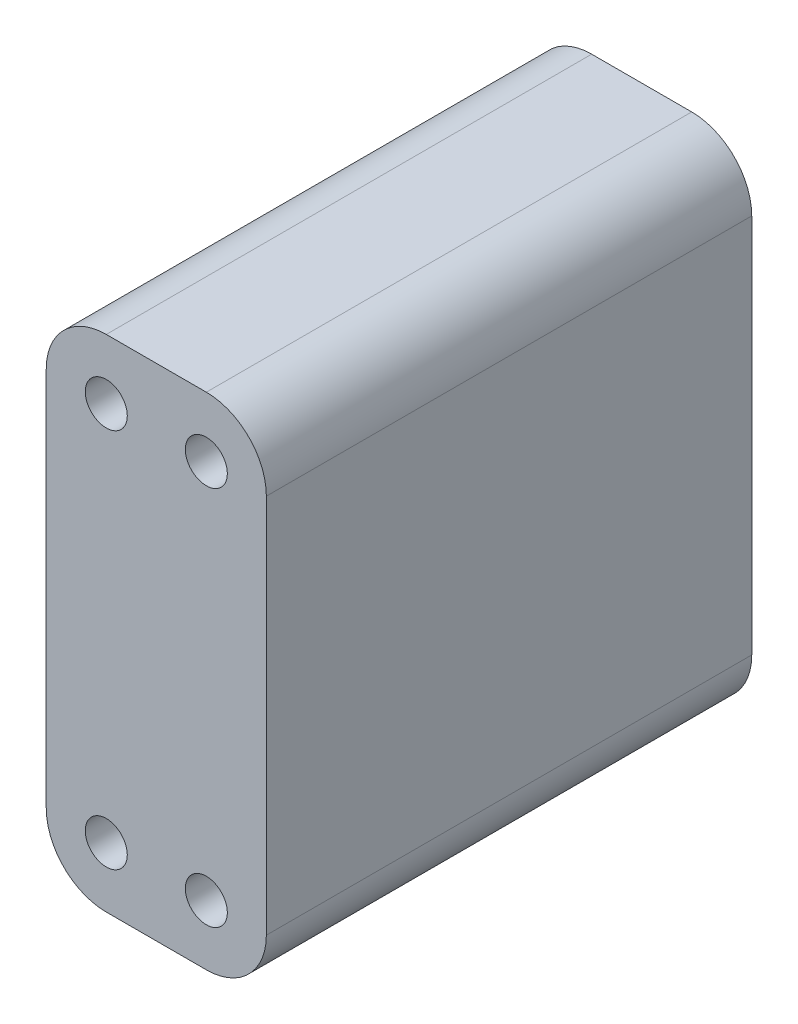
ISO-10303-21;
HEADER;
FILE_DESCRIPTION(('STEP AP214'),'2;1');
FILE_NAME('part.step','',(''),(''),'','','');
FILE_SCHEMA(('AUTOMOTIVE_DESIGN { 1 0 10303 214 1 1 1 1 }'));
ENDSEC;
DATA;
#1=APPLICATION_CONTEXT('core data for automotive mechanical design processes');
#2=APPLICATION_PROTOCOL_DEFINITION('international standard','automotive_design',2000,#1);
#3=PRODUCT_CONTEXT('',#1,'mechanical');
#4=PRODUCT('Part','Part','',(#3));
#5=PRODUCT_RELATED_PRODUCT_CATEGORY('part','',(#4));
#6=PRODUCT_DEFINITION_FORMATION('','',#4);
#7=PRODUCT_DEFINITION_CONTEXT('part definition',#1,'design');
#8=PRODUCT_DEFINITION('design','',#6,#7);
#9=PRODUCT_DEFINITION_SHAPE('','',#8);
#10=(LENGTH_UNIT() NAMED_UNIT(*) SI_UNIT(.MILLI.,.METRE.));
#11=(NAMED_UNIT(*) PLANE_ANGLE_UNIT() SI_UNIT($,.RADIAN.));
#12=(NAMED_UNIT(*) SI_UNIT($,.STERADIAN.) SOLID_ANGLE_UNIT());
#13=UNCERTAINTY_MEASURE_WITH_UNIT(LENGTH_MEASURE(1.E-05),#10,'distance_accuracy_value','');
#14=(GEOMETRIC_REPRESENTATION_CONTEXT(3) GLOBAL_UNCERTAINTY_ASSIGNED_CONTEXT((#13)) GLOBAL_UNIT_ASSIGNED_CONTEXT((#10,
#11,#12)) REPRESENTATION_CONTEXT('',''));
#15=CARTESIAN_POINT('',(0.,0.,0.));
#16=DIRECTION('',(0.,0.,1.));
#17=DIRECTION('',(1.,0.,0.));
#18=AXIS2_PLACEMENT_3D('',#15,#16,#17);
#19=CARTESIAN_POINT('',(-11.,25.,48.514));
#20=DIRECTION('',(1.,0.,0.));
#21=DIRECTION('',(0.,0.,-1.));
#22=AXIS2_PLACEMENT_3D('',#19,#20,#21);
#23=PLANE('',#22);
#24=DIRECTION('',(0.,-1.,0.));
#25=VECTOR('',#24,1.);
#26=CARTESIAN_POINT('',(-11.,25.,48.514));
#27=LINE('',#26,#25);
#28=CARTESIAN_POINT('',(-11.,19.,48.514));
#29=VERTEX_POINT('',#28);
#30=CARTESIAN_POINT('',(-11.,-19.,48.514));
#31=VERTEX_POINT('',#30);
#32=EDGE_CURVE('E135',#29,#31,#27,.T.);
#33=ORIENTED_EDGE('',*,*,#32,.F.);
#34=DIRECTION('',(0.,0.,-1.));
#35=VECTOR('',#34,1.);
#36=CARTESIAN_POINT('',(-11.,19.,48.514));
#37=LINE('',#36,#35);
#38=CARTESIAN_POINT('',(-11.,19.,0.));
#39=VERTEX_POINT('',#38);
#40=EDGE_CURVE('E174',#29,#39,#37,.T.);
#41=ORIENTED_EDGE('',*,*,#40,.T.);
#42=DIRECTION('',(0.,-1.,0.));
#43=VECTOR('',#42,1.);
#44=CARTESIAN_POINT('',(-11.,25.,0.));
#45=LINE('',#44,#43);
#46=CARTESIAN_POINT('',(-11.,-19.,0.));
#47=VERTEX_POINT('',#46);
#48=EDGE_CURVE('E189',#39,#47,#45,.T.);
#49=ORIENTED_EDGE('',*,*,#48,.T.);
#50=DIRECTION('',(0.,0.,-1.));
#51=VECTOR('',#50,1.);
#52=CARTESIAN_POINT('',(-11.,-19.,48.514));
#53=LINE('',#52,#51);
#54=EDGE_CURVE('E171',#47,#31,#53,.F.);
#55=ORIENTED_EDGE('',*,*,#54,.T.);
#56=EDGE_LOOP('',(#33,#41,#49,#55));
#57=FACE_BOUND('',#56,.T.);
#58=ADVANCED_FACE('F39',(#57),#23,.F.);
#59=CARTESIAN_POINT('',(-11.,-25.,48.514));
#60=DIRECTION('',(0.,1.,0.));
#61=DIRECTION('',(-1.,0.,0.));
#62=AXIS2_PLACEMENT_3D('',#59,#60,#61);
#63=PLANE('',#62);
#64=DIRECTION('',(1.,0.,0.));
#65=VECTOR('',#64,1.);
#66=CARTESIAN_POINT('',(-11.,-25.,48.514));
#67=LINE('',#66,#65);
#68=CARTESIAN_POINT('',(-5.00000000000001,-25.,48.514));
#69=VERTEX_POINT('',#68);
#70=CARTESIAN_POINT('',(4.99999999999999,-25.,48.514));
#71=VERTEX_POINT('',#70);
#72=EDGE_CURVE('E140',#69,#71,#67,.T.);
#73=ORIENTED_EDGE('',*,*,#72,.F.);
#74=DIRECTION('',(0.,0.,-1.));
#75=VECTOR('',#74,1.);
#76=CARTESIAN_POINT('',(-5.00000000000001,-25.,48.514));
#77=LINE('',#76,#75);
#78=CARTESIAN_POINT('',(-5.00000000000001,-25.,0.));
#79=VERTEX_POINT('',#78);
#80=EDGE_CURVE('E11',#69,#79,#77,.T.);
#81=ORIENTED_EDGE('',*,*,#80,.T.);
#82=DIRECTION('',(1.,0.,0.));
#83=VECTOR('',#82,1.);
#84=CARTESIAN_POINT('',(-11.,-25.,0.));
#85=LINE('',#84,#83);
#86=CARTESIAN_POINT('',(4.99999999999999,-25.,0.));
#87=VERTEX_POINT('',#86);
#88=EDGE_CURVE('E142',#79,#87,#85,.T.);
#89=ORIENTED_EDGE('',*,*,#88,.T.);
#90=DIRECTION('',(0.,0.,-1.));
#91=VECTOR('',#90,1.);
#92=CARTESIAN_POINT('',(4.99999999999999,-25.,48.514));
#93=LINE('',#92,#91);
#94=EDGE_CURVE('E48',#87,#71,#93,.F.);
#95=ORIENTED_EDGE('',*,*,#94,.T.);
#96=EDGE_LOOP('',(#73,#81,#89,#95));
#97=FACE_BOUND('',#96,.T.);
#98=ADVANCED_FACE('F195',(#97),#63,.F.);
#99=CARTESIAN_POINT('',(11.,25.,48.514));
#100=DIRECTION('',(-1.,0.,0.));
#101=DIRECTION('',(0.,-1.,0.));
#102=AXIS2_PLACEMENT_3D('',#99,#100,#101);
#103=PLANE('',#102);
#104=DIRECTION('',(0.,1.,0.));
#105=VECTOR('',#104,1.);
#106=CARTESIAN_POINT('',(11.,25.,0.));
#107=LINE('',#106,#105);
#108=CARTESIAN_POINT('',(11.,-19.,0.));
#109=VERTEX_POINT('',#108);
#110=CARTESIAN_POINT('',(11.,19.,0.));
#111=VERTEX_POINT('',#110);
#112=EDGE_CURVE('E136',#109,#111,#107,.T.);
#113=ORIENTED_EDGE('',*,*,#112,.T.);
#114=DIRECTION('',(0.,0.,-1.));
#115=VECTOR('',#114,1.);
#116=CARTESIAN_POINT('',(11.,19.,48.514));
#117=LINE('',#116,#115);
#118=CARTESIAN_POINT('',(11.,19.,48.514));
#119=VERTEX_POINT('',#118);
#120=EDGE_CURVE('E111',#111,#119,#117,.F.);
#121=ORIENTED_EDGE('',*,*,#120,.T.);
#122=DIRECTION('',(0.,1.,0.));
#123=VECTOR('',#122,1.);
#124=CARTESIAN_POINT('',(11.,25.,48.514));
#125=LINE('',#124,#123);
#126=CARTESIAN_POINT('',(11.,-19.,48.514));
#127=VERTEX_POINT('',#126);
#128=EDGE_CURVE('E180',#127,#119,#125,.T.);
#129=ORIENTED_EDGE('',*,*,#128,.F.);
#130=DIRECTION('',(0.,0.,-1.));
#131=VECTOR('',#130,1.);
#132=CARTESIAN_POINT('',(11.,-19.,48.514));
#133=LINE('',#132,#131);
#134=EDGE_CURVE('E117',#127,#109,#133,.T.);
#135=ORIENTED_EDGE('',*,*,#134,.T.);
#136=EDGE_LOOP('',(#113,#121,#129,#135));
#137=FACE_BOUND('',#136,.T.);
#138=ADVANCED_FACE('F202',(#137),#103,.F.);
#139=CARTESIAN_POINT('',(-11.,25.,48.514));
#140=DIRECTION('',(0.,-1.,0.));
#141=DIRECTION('',(1.,0.,0.));
#142=AXIS2_PLACEMENT_3D('',#139,#140,#141);
#143=PLANE('',#142);
#144=DIRECTION('',(-1.,0.,0.));
#145=VECTOR('',#144,1.);
#146=CARTESIAN_POINT('',(-11.,25.,48.514));
#147=LINE('',#146,#145);
#148=CARTESIAN_POINT('',(4.99999999999999,25.,48.514));
#149=VERTEX_POINT('',#148);
#150=CARTESIAN_POINT('',(-5.00000000000001,25.,48.514));
#151=VERTEX_POINT('',#150);
#152=EDGE_CURVE('E127',#149,#151,#147,.T.);
#153=ORIENTED_EDGE('',*,*,#152,.F.);
#154=DIRECTION('',(0.,0.,-1.));
#155=VECTOR('',#154,1.);
#156=CARTESIAN_POINT('',(4.99999999999999,25.,48.514));
#157=LINE('',#156,#155);
#158=CARTESIAN_POINT('',(4.99999999999999,25.,0.));
#159=VERTEX_POINT('',#158);
#160=EDGE_CURVE('E110',#149,#159,#157,.T.);
#161=ORIENTED_EDGE('',*,*,#160,.T.);
#162=DIRECTION('',(-1.,0.,0.));
#163=VECTOR('',#162,1.);
#164=CARTESIAN_POINT('',(-11.,25.,0.));
#165=LINE('',#164,#163);
#166=CARTESIAN_POINT('',(-5.00000000000001,25.,0.));
#167=VERTEX_POINT('',#166);
#168=EDGE_CURVE('E124',#159,#167,#165,.T.);
#169=ORIENTED_EDGE('',*,*,#168,.T.);
#170=DIRECTION('',(0.,0.,-1.));
#171=VECTOR('',#170,1.);
#172=CARTESIAN_POINT('',(-5.00000000000001,25.,48.514));
#173=LINE('',#172,#171);
#174=EDGE_CURVE('E130',#167,#151,#173,.F.);
#175=ORIENTED_EDGE('',*,*,#174,.T.);
#176=EDGE_LOOP('',(#153,#161,#169,#175));
#177=FACE_BOUND('',#176,.T.);
#178=ADVANCED_FACE('F123',(#177),#143,.F.);
#179=CARTESIAN_POINT('',(0.,0.,48.514));
#180=DIRECTION('',(0.,0.,1.));
#181=DIRECTION('',(1.,0.,0.));
#182=AXIS2_PLACEMENT_3D('',#179,#180,#181);
#183=PLANE('',#182);
#184=CARTESIAN_POINT('',(4.99999999999999,19.,48.514));
#185=DIRECTION('',(0.,0.,1.));
#186=DIRECTION('',(1.,0.,0.));
#187=AXIS2_PLACEMENT_3D('',#184,#185,#186);
#188=CIRCLE('',#187,2.1);
#189=CARTESIAN_POINT('',(7.1,19.,48.514));
#190=VERTEX_POINT('',#189);
#191=EDGE_CURVE('E282',#190,#190,#188,.T.);
#192=ORIENTED_EDGE('',*,*,#191,.F.);
#193=EDGE_LOOP('',(#192));
#194=FACE_BOUND('',#193,.T.);
#195=CARTESIAN_POINT('',(-5.00000000000001,-19.,48.514));
#196=DIRECTION('',(0.,0.,1.));
#197=DIRECTION('',(1.,0.,0.));
#198=AXIS2_PLACEMENT_3D('',#195,#196,#197);
#199=CIRCLE('',#198,2.1);
#200=CARTESIAN_POINT('',(-2.9,-19.,48.514));
#201=VERTEX_POINT('',#200);
#202=EDGE_CURVE('E276',#201,#201,#199,.T.);
#203=ORIENTED_EDGE('',*,*,#202,.F.);
#204=EDGE_LOOP('',(#203));
#205=FACE_BOUND('',#204,.T.);
#206=CARTESIAN_POINT('',(4.99999999999999,-19.,48.514));
#207=DIRECTION('',(0.,0.,1.));
#208=DIRECTION('',(1.,0.,0.));
#209=AXIS2_PLACEMENT_3D('',#206,#207,#208);
#210=CIRCLE('',#209,2.1);
#211=CARTESIAN_POINT('',(7.1,-19.,48.514));
#212=VERTEX_POINT('',#211);
#213=EDGE_CURVE('E288',#212,#212,#210,.T.);
#214=ORIENTED_EDGE('',*,*,#213,.F.);
#215=EDGE_LOOP('',(#214));
#216=FACE_BOUND('',#215,.T.);
#217=CARTESIAN_POINT('',(-5.00000000000001,19.,48.514));
#218=DIRECTION('',(0.,0.,1.));
#219=DIRECTION('',(1.,0.,0.));
#220=AXIS2_PLACEMENT_3D('',#217,#218,#219);
#221=CIRCLE('',#220,2.1);
#222=CARTESIAN_POINT('',(-2.9,19.,48.514));
#223=VERTEX_POINT('',#222);
#224=EDGE_CURVE('E271',#223,#223,#221,.T.);
#225=ORIENTED_EDGE('',*,*,#224,.F.);
#226=EDGE_LOOP('',(#225));
#227=FACE_BOUND('',#226,.T.);
#228=ORIENTED_EDGE('',*,*,#128,.T.);
#229=CARTESIAN_POINT('',(4.99999999999999,19.,48.514));
#230=DIRECTION('',(0.,0.,1.));
#231=DIRECTION('',(1.,0.,0.));
#232=AXIS2_PLACEMENT_3D('',#229,#230,#231);
#233=CIRCLE('',#232,6.);
#234=EDGE_CURVE('E168',#119,#149,#233,.T.);
#235=ORIENTED_EDGE('',*,*,#234,.T.);
#236=ORIENTED_EDGE('',*,*,#152,.T.);
#237=CARTESIAN_POINT('',(-5.00000000000001,19.,48.514));
#238=DIRECTION('',(0.,0.,1.));
#239=DIRECTION('',(1.,0.,0.));
#240=AXIS2_PLACEMENT_3D('',#237,#238,#239);
#241=CIRCLE('',#240,6.);
#242=EDGE_CURVE('E165',#151,#29,#241,.T.);
#243=ORIENTED_EDGE('',*,*,#242,.T.);
#244=ORIENTED_EDGE('',*,*,#32,.T.);
#245=CARTESIAN_POINT('',(-5.00000000000001,-19.,48.514));
#246=DIRECTION('',(0.,0.,1.));
#247=DIRECTION('',(1.,0.,0.));
#248=AXIS2_PLACEMENT_3D('',#245,#246,#247);
#249=CIRCLE('',#248,6.);
#250=EDGE_CURVE('E61',#31,#69,#249,.T.);
#251=ORIENTED_EDGE('',*,*,#250,.T.);
#252=ORIENTED_EDGE('',*,*,#72,.T.);
#253=CARTESIAN_POINT('',(4.99999999999999,-19.,48.514));
#254=DIRECTION('',(0.,0.,1.));
#255=DIRECTION('',(1.,0.,0.));
#256=AXIS2_PLACEMENT_3D('',#253,#254,#255);
#257=CIRCLE('',#256,6.);
#258=EDGE_CURVE('E160',#71,#127,#257,.T.);
#259=ORIENTED_EDGE('',*,*,#258,.T.);
#260=EDGE_LOOP('',(#228,#235,#236,#243,#244,#251,#252,#259));
#261=FACE_BOUND('',#260,.T.);
#262=ADVANCED_FACE('F200',(#194,#205,#216,#227,#261),#183,.T.);
#263=CARTESIAN_POINT('',(0.,0.,0.));
#264=DIRECTION('',(0.,0.,1.));
#265=DIRECTION('',(1.,0.,0.));
#266=AXIS2_PLACEMENT_3D('',#263,#264,#265);
#267=PLANE('',#266);
#268=CARTESIAN_POINT('',(4.99999999999999,19.,0.));
#269=DIRECTION('',(0.,0.,1.));
#270=DIRECTION('',(1.,0.,0.));
#271=AXIS2_PLACEMENT_3D('',#268,#269,#270);
#272=CIRCLE('',#271,2.1);
#273=CARTESIAN_POINT('',(7.1,19.,0.));
#274=VERTEX_POINT('',#273);
#275=EDGE_CURVE('E260',#274,#274,#272,.T.);
#276=ORIENTED_EDGE('',*,*,#275,.T.);
#277=EDGE_LOOP('',(#276));
#278=FACE_BOUND('',#277,.T.);
#279=CARTESIAN_POINT('',(-5.00000000000001,-19.,0.));
#280=DIRECTION('',(0.,0.,1.));
#281=DIRECTION('',(1.,0.,0.));
#282=AXIS2_PLACEMENT_3D('',#279,#280,#281);
#283=CIRCLE('',#282,2.1);
#284=CARTESIAN_POINT('',(-2.9,-19.,0.));
#285=VERTEX_POINT('',#284);
#286=EDGE_CURVE('E264',#285,#285,#283,.T.);
#287=ORIENTED_EDGE('',*,*,#286,.T.);
#288=EDGE_LOOP('',(#287));
#289=FACE_BOUND('',#288,.T.);
#290=CARTESIAN_POINT('',(4.99999999999999,-19.,0.));
#291=DIRECTION('',(0.,0.,1.));
#292=DIRECTION('',(1.,0.,0.));
#293=AXIS2_PLACEMENT_3D('',#290,#291,#292);
#294=CIRCLE('',#293,2.1);
#295=CARTESIAN_POINT('',(7.1,-19.,0.));
#296=VERTEX_POINT('',#295);
#297=EDGE_CURVE('E268',#296,#296,#294,.T.);
#298=ORIENTED_EDGE('',*,*,#297,.T.);
#299=EDGE_LOOP('',(#298));
#300=FACE_BOUND('',#299,.T.);
#301=CARTESIAN_POINT('',(-5.00000000000001,19.,0.));
#302=DIRECTION('',(0.,0.,1.));
#303=DIRECTION('',(1.,0.,0.));
#304=AXIS2_PLACEMENT_3D('',#301,#302,#303);
#305=CIRCLE('',#304,2.1);
#306=CARTESIAN_POINT('',(-2.9,19.,0.));
#307=VERTEX_POINT('',#306);
#308=EDGE_CURVE('E192',#307,#307,#305,.T.);
#309=ORIENTED_EDGE('',*,*,#308,.T.);
#310=EDGE_LOOP('',(#309));
#311=FACE_BOUND('',#310,.T.);
#312=ORIENTED_EDGE('',*,*,#168,.F.);
#313=CARTESIAN_POINT('',(4.99999999999999,19.,0.));
#314=DIRECTION('',(0.,0.,1.));
#315=DIRECTION('',(1.,0.,0.));
#316=AXIS2_PLACEMENT_3D('',#313,#314,#315);
#317=CIRCLE('',#316,6.);
#318=EDGE_CURVE('E106',#159,#111,#317,.F.);
#319=ORIENTED_EDGE('',*,*,#318,.T.);
#320=ORIENTED_EDGE('',*,*,#112,.F.);
#321=CARTESIAN_POINT('',(4.99999999999999,-19.,0.));
#322=DIRECTION('',(0.,0.,1.));
#323=DIRECTION('',(1.,0.,0.));
#324=AXIS2_PLACEMENT_3D('',#321,#322,#323);
#325=CIRCLE('',#324,6.);
#326=EDGE_CURVE('E129',#109,#87,#325,.F.);
#327=ORIENTED_EDGE('',*,*,#326,.T.);
#328=ORIENTED_EDGE('',*,*,#88,.F.);
#329=CARTESIAN_POINT('',(-5.00000000000001,-19.,0.));
#330=DIRECTION('',(0.,0.,1.));
#331=DIRECTION('',(1.,0.,0.));
#332=AXIS2_PLACEMENT_3D('',#329,#330,#331);
#333=CIRCLE('',#332,6.);
#334=EDGE_CURVE('E150',#79,#47,#333,.F.);
#335=ORIENTED_EDGE('',*,*,#334,.T.);
#336=ORIENTED_EDGE('',*,*,#48,.F.);
#337=CARTESIAN_POINT('',(-5.00000000000001,19.,0.));
#338=DIRECTION('',(0.,0.,1.));
#339=DIRECTION('',(1.,0.,0.));
#340=AXIS2_PLACEMENT_3D('',#337,#338,#339);
#341=CIRCLE('',#340,6.);
#342=EDGE_CURVE('E118',#39,#167,#341,.F.);
#343=ORIENTED_EDGE('',*,*,#342,.T.);
#344=EDGE_LOOP('',(#312,#319,#320,#327,#328,#335,#336,#343));
#345=FACE_BOUND('',#344,.T.);
#346=ADVANCED_FACE('F132',(#278,#289,#300,#311,#345),#267,.F.);
#347=CARTESIAN_POINT('',(4.99999999999999,19.,48.514));
#348=DIRECTION('',(0.,0.,-1.));
#349=DIRECTION('',(-1.,0.,0.));
#350=AXIS2_PLACEMENT_3D('',#347,#348,#349);
#351=CYLINDRICAL_SURFACE('',#350,6.);
#352=ORIENTED_EDGE('',*,*,#234,.F.);
#353=ORIENTED_EDGE('',*,*,#120,.F.);
#354=ORIENTED_EDGE('',*,*,#318,.F.);
#355=ORIENTED_EDGE('',*,*,#160,.F.);
#356=EDGE_LOOP('',(#352,#353,#354,#355));
#357=FACE_BOUND('',#356,.T.);
#358=ADVANCED_FACE('F109',(#357),#351,.T.);
#359=CARTESIAN_POINT('',(-5.00000000000001,19.,48.514));
#360=DIRECTION('',(0.,0.,-1.));
#361=DIRECTION('',(-1.,0.,0.));
#362=AXIS2_PLACEMENT_3D('',#359,#360,#361);
#363=CYLINDRICAL_SURFACE('',#362,6.);
#364=ORIENTED_EDGE('',*,*,#242,.F.);
#365=ORIENTED_EDGE('',*,*,#174,.F.);
#366=ORIENTED_EDGE('',*,*,#342,.F.);
#367=ORIENTED_EDGE('',*,*,#40,.F.);
#368=EDGE_LOOP('',(#364,#365,#366,#367));
#369=FACE_BOUND('',#368,.T.);
#370=ADVANCED_FACE('F220',(#369),#363,.T.);
#371=CARTESIAN_POINT('',(-5.00000000000001,-19.,48.514));
#372=DIRECTION('',(0.,0.,-1.));
#373=DIRECTION('',(-1.,0.,0.));
#374=AXIS2_PLACEMENT_3D('',#371,#372,#373);
#375=CYLINDRICAL_SURFACE('',#374,6.);
#376=ORIENTED_EDGE('',*,*,#250,.F.);
#377=ORIENTED_EDGE('',*,*,#54,.F.);
#378=ORIENTED_EDGE('',*,*,#334,.F.);
#379=ORIENTED_EDGE('',*,*,#80,.F.);
#380=EDGE_LOOP('',(#376,#377,#378,#379));
#381=FACE_BOUND('',#380,.T.);
#382=ADVANCED_FACE('F222',(#381),#375,.T.);
#383=CARTESIAN_POINT('',(4.99999999999999,-19.,48.514));
#384=DIRECTION('',(0.,0.,-1.));
#385=DIRECTION('',(-1.,0.,0.));
#386=AXIS2_PLACEMENT_3D('',#383,#384,#385);
#387=CYLINDRICAL_SURFACE('',#386,6.);
#388=ORIENTED_EDGE('',*,*,#258,.F.);
#389=ORIENTED_EDGE('',*,*,#94,.F.);
#390=ORIENTED_EDGE('',*,*,#326,.F.);
#391=ORIENTED_EDGE('',*,*,#134,.F.);
#392=EDGE_LOOP('',(#388,#389,#390,#391));
#393=FACE_BOUND('',#392,.T.);
#394=ADVANCED_FACE('F41',(#393),#387,.T.);
#395=CARTESIAN_POINT('',(-5.00000000000001,19.,0.));
#396=DIRECTION('',(0.,0.,1.));
#397=DIRECTION('',(1.,0.,0.));
#398=AXIS2_PLACEMENT_3D('',#395,#396,#397);
#399=CYLINDRICAL_SURFACE('',#398,2.1);
#400=ORIENTED_EDGE('',*,*,#308,.F.);
#401=EDGE_LOOP('',(#400));
#402=FACE_BOUND('',#401,.T.);
#403=ORIENTED_EDGE('',*,*,#224,.T.);
#404=EDGE_LOOP('',(#403));
#405=FACE_BOUND('',#404,.T.);
#406=ADVANCED_FACE('F229',(#402,#405),#399,.F.);
#407=CARTESIAN_POINT('',(4.99999999999999,-19.,0.));
#408=DIRECTION('',(0.,0.,1.));
#409=DIRECTION('',(1.,0.,0.));
#410=AXIS2_PLACEMENT_3D('',#407,#408,#409);
#411=CYLINDRICAL_SURFACE('',#410,2.1);
#412=ORIENTED_EDGE('',*,*,#297,.F.);
#413=EDGE_LOOP('',(#412));
#414=FACE_BOUND('',#413,.T.);
#415=ORIENTED_EDGE('',*,*,#213,.T.);
#416=EDGE_LOOP('',(#415));
#417=FACE_BOUND('',#416,.T.);
#418=ADVANCED_FACE('F236',(#414,#417),#411,.F.);
#419=CARTESIAN_POINT('',(-5.00000000000001,-19.,0.));
#420=DIRECTION('',(0.,0.,1.));
#421=DIRECTION('',(1.,0.,0.));
#422=AXIS2_PLACEMENT_3D('',#419,#420,#421);
#423=CYLINDRICAL_SURFACE('',#422,2.1);
#424=ORIENTED_EDGE('',*,*,#286,.F.);
#425=EDGE_LOOP('',(#424));
#426=FACE_BOUND('',#425,.T.);
#427=ORIENTED_EDGE('',*,*,#202,.T.);
#428=EDGE_LOOP('',(#427));
#429=FACE_BOUND('',#428,.T.);
#430=ADVANCED_FACE('F242',(#426,#429),#423,.F.);
#431=CARTESIAN_POINT('',(4.99999999999999,19.,0.));
#432=DIRECTION('',(0.,0.,1.));
#433=DIRECTION('',(1.,0.,0.));
#434=AXIS2_PLACEMENT_3D('',#431,#432,#433);
#435=CYLINDRICAL_SURFACE('',#434,2.1);
#436=ORIENTED_EDGE('',*,*,#275,.F.);
#437=EDGE_LOOP('',(#436));
#438=FACE_BOUND('',#437,.T.);
#439=ORIENTED_EDGE('',*,*,#191,.T.);
#440=EDGE_LOOP('',(#439));
#441=FACE_BOUND('',#440,.T.);
#442=ADVANCED_FACE('F300',(#438,#441),#435,.F.);
#443=CLOSED_SHELL('',(#58,#98,#138,#178,#262,#346,#358,#370,#382,#394,#406,#418,#430,#442));
#444=MANIFOLD_SOLID_BREP('B2',#443);
#445=ADVANCED_BREP_SHAPE_REPRESENTATION('',(#18,#444),#14);
#446=SHAPE_DEFINITION_REPRESENTATION(#9,#445);
ENDSEC;
END-ISO-10303-21;
